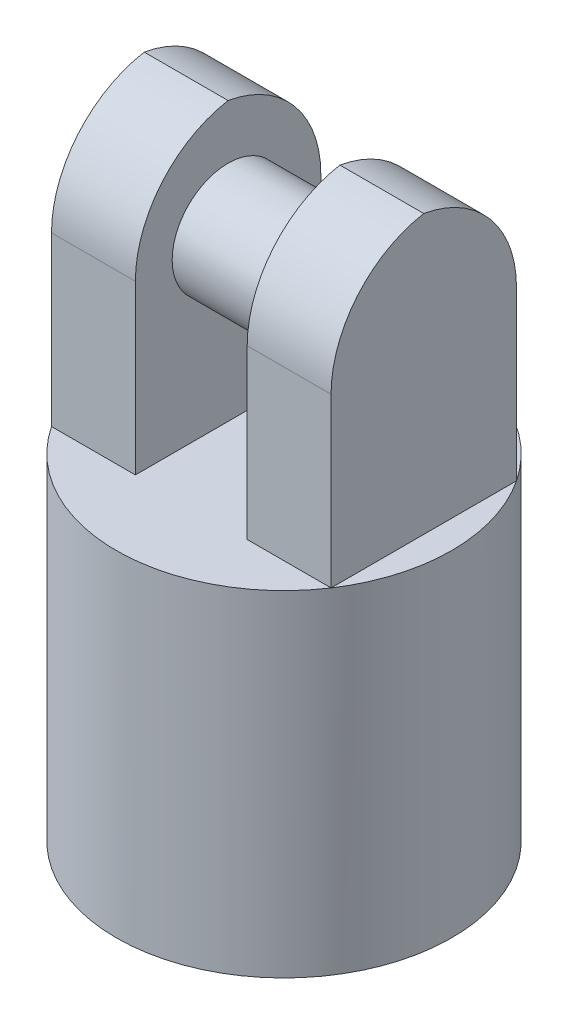
ISO-10303-21;
HEADER;
FILE_DESCRIPTION(('STEP AP214'),'2;1');
FILE_NAME('part.step','',(''),(''),'','','');
FILE_SCHEMA(('AUTOMOTIVE_DESIGN { 1 0 10303 214 1 1 1 1 }'));
ENDSEC;
DATA;
#1=APPLICATION_CONTEXT('core data for automotive mechanical design processes');
#2=APPLICATION_PROTOCOL_DEFINITION('international standard','automotive_design',2000,#1);
#3=PRODUCT_CONTEXT('',#1,'mechanical');
#4=PRODUCT('Part','Part','',(#3));
#5=PRODUCT_RELATED_PRODUCT_CATEGORY('part','',(#4));
#6=PRODUCT_DEFINITION_FORMATION('','',#4);
#7=PRODUCT_DEFINITION_CONTEXT('part definition',#1,'design');
#8=PRODUCT_DEFINITION('design','',#6,#7);
#9=PRODUCT_DEFINITION_SHAPE('','',#8);
#10=(LENGTH_UNIT() NAMED_UNIT(*) SI_UNIT(.MILLI.,.METRE.));
#11=(NAMED_UNIT(*) PLANE_ANGLE_UNIT() SI_UNIT($,.RADIAN.));
#12=(NAMED_UNIT(*) SI_UNIT($,.STERADIAN.) SOLID_ANGLE_UNIT());
#13=UNCERTAINTY_MEASURE_WITH_UNIT(LENGTH_MEASURE(1.E-05),#10,'distance_accuracy_value','');
#14=(GEOMETRIC_REPRESENTATION_CONTEXT(3) GLOBAL_UNCERTAINTY_ASSIGNED_CONTEXT((#13)) GLOBAL_UNIT_ASSIGNED_CONTEXT((#10,
#11,#12)) REPRESENTATION_CONTEXT('',''));
#15=CARTESIAN_POINT('',(0.,0.,0.));
#16=DIRECTION('',(0.,0.,1.));
#17=DIRECTION('',(1.,0.,0.));
#18=AXIS2_PLACEMENT_3D('',#15,#16,#17);
#19=CARTESIAN_POINT('',(-31.75,139.7,-21.0605674187568));
#20=DIRECTION('',(0.,0.,1.));
#21=DIRECTION('',(1.,0.,0.));
#22=AXIS2_PLACEMENT_3D('',#19,#20,#21);
#23=PLANE('',#22);
#24=DIRECTION('',(0.,1.,0.));
#25=VECTOR('',#24,1.);
#26=CARTESIAN_POINT('',(12.7,76.2,-21.0605674187568));
#27=LINE('',#26,#25);
#28=CARTESIAN_POINT('',(12.7,76.2,-21.0605674187568));
#29=VERTEX_POINT('',#28);
#30=CARTESIAN_POINT('',(12.7,114.3,-21.0605674187568));
#31=VERTEX_POINT('',#30);
#32=EDGE_CURVE('E120',#29,#31,#27,.T.);
#33=ORIENTED_EDGE('',*,*,#32,.T.);
#34=DIRECTION('',(-1.,0.,0.));
#35=VECTOR('',#34,1.);
#36=CARTESIAN_POINT('',(-31.75,114.3,-21.0605674187568));
#37=LINE('',#36,#35);
#38=CARTESIAN_POINT('',(31.75,114.3,-21.0605674187568));
#39=VERTEX_POINT('',#38);
#40=EDGE_CURVE('E211',#31,#39,#37,.F.);
#41=ORIENTED_EDGE('',*,*,#40,.T.);
#42=DIRECTION('',(0.,-1.,0.));
#43=VECTOR('',#42,1.);
#44=CARTESIAN_POINT('',(31.75,139.7,-21.0605674187568));
#45=LINE('',#44,#43);
#46=CARTESIAN_POINT('',(31.75,76.2,-21.0605674187568));
#47=VERTEX_POINT('',#46);
#48=EDGE_CURVE('E149',#39,#47,#45,.T.);
#49=ORIENTED_EDGE('',*,*,#48,.T.);
#50=DIRECTION('',(-1.,0.,0.));
#51=VECTOR('',#50,1.);
#52=CARTESIAN_POINT('',(-31.75,76.2,-21.0605674187568));
#53=LINE('',#52,#51);
#54=EDGE_CURVE('E141',#47,#29,#53,.T.);
#55=ORIENTED_EDGE('',*,*,#54,.T.);
#56=EDGE_LOOP('',(#33,#41,#49,#55));
#57=FACE_BOUND('',#56,.T.);
#58=ADVANCED_FACE('F45',(#57),#23,.F.);
#59=CARTESIAN_POINT('',(-31.75,139.7,21.0605674187568));
#60=DIRECTION('',(0.,0.,-1.));
#61=DIRECTION('',(-1.,0.,0.));
#62=AXIS2_PLACEMENT_3D('',#59,#60,#61);
#63=PLANE('',#62);
#64=DIRECTION('',(0.,-1.,0.));
#65=VECTOR('',#64,1.);
#66=CARTESIAN_POINT('',(31.75,139.7,21.0605674187568));
#67=LINE('',#66,#65);
#68=CARTESIAN_POINT('',(31.75,114.3,21.0605674187568));
#69=VERTEX_POINT('',#68);
#70=CARTESIAN_POINT('',(31.75,76.2,21.0605674187568));
#71=VERTEX_POINT('',#70);
#72=EDGE_CURVE('E166',#69,#71,#67,.T.);
#73=ORIENTED_EDGE('',*,*,#72,.F.);
#74=DIRECTION('',(1.,0.,0.));
#75=VECTOR('',#74,1.);
#76=CARTESIAN_POINT('',(-31.75,114.3,21.0605674187568));
#77=LINE('',#76,#75);
#78=CARTESIAN_POINT('',(12.7,114.3,21.0605674187568));
#79=VERTEX_POINT('',#78);
#80=EDGE_CURVE('E11',#69,#79,#77,.F.);
#81=ORIENTED_EDGE('',*,*,#80,.T.);
#82=DIRECTION('',(0.,1.,0.));
#83=VECTOR('',#82,1.);
#84=CARTESIAN_POINT('',(12.7,76.2,21.0605674187568));
#85=LINE('',#84,#83);
#86=CARTESIAN_POINT('',(12.7,76.2,21.0605674187568));
#87=VERTEX_POINT('',#86);
#88=EDGE_CURVE('E241',#87,#79,#85,.T.);
#89=ORIENTED_EDGE('',*,*,#88,.F.);
#90=DIRECTION('',(1.,0.,0.));
#91=VECTOR('',#90,1.);
#92=CARTESIAN_POINT('',(-31.75,76.2,21.0605674187568));
#93=LINE('',#92,#91);
#94=EDGE_CURVE('E145',#87,#71,#93,.T.);
#95=ORIENTED_EDGE('',*,*,#94,.T.);
#96=EDGE_LOOP('',(#73,#81,#89,#95));
#97=FACE_BOUND('',#96,.T.);
#98=ADVANCED_FACE('F295',(#97),#63,.F.);
#99=CARTESIAN_POINT('',(0.,76.2,0.));
#100=DIRECTION('',(0.,1.,0.));
#101=DIRECTION('',(0.,0.,1.));
#102=AXIS2_PLACEMENT_3D('',#99,#100,#101);
#103=PLANE('',#102);
#104=DIRECTION('',(0.,0.,-1.));
#105=VECTOR('',#104,1.);
#106=CARTESIAN_POINT('',(31.75,76.2,21.0605674187568));
#107=LINE('',#106,#105);
#108=EDGE_CURVE('E159',#71,#47,#107,.T.);
#109=ORIENTED_EDGE('',*,*,#108,.F.);
#110=CARTESIAN_POINT('',(0.,76.2,0.));
#111=DIRECTION('',(0.,1.,0.));
#112=DIRECTION('',(0.,0.,1.));
#113=AXIS2_PLACEMENT_3D('',#110,#111,#112);
#114=CIRCLE('',#113,38.1);
#115=EDGE_CURVE('E178',#71,#47,#114,.T.);
#116=ORIENTED_EDGE('',*,*,#115,.T.);
#117=EDGE_LOOP('',(#109,#116));
#118=FACE_BOUND('',#117,.T.);
#119=ADVANCED_FACE('F290',(#118),#103,.T.);
#120=DIRECTION('',(0.,0.,1.));
#121=VECTOR('',#120,1.);
#122=CARTESIAN_POINT('',(-31.75,76.2,21.0605674187568));
#123=LINE('',#122,#121);
#124=CARTESIAN_POINT('',(-31.75,76.2,-21.0605674187568));
#125=VERTEX_POINT('',#124);
#126=CARTESIAN_POINT('',(-31.75,76.2,21.0605674187568));
#127=VERTEX_POINT('',#126);
#128=EDGE_CURVE('E151',#125,#127,#123,.T.);
#129=ORIENTED_EDGE('',*,*,#128,.F.);
#130=EDGE_CURVE('E264',#125,#127,#114,.T.);
#131=ORIENTED_EDGE('',*,*,#130,.T.);
#132=EDGE_LOOP('',(#129,#131));
#133=FACE_BOUND('',#132,.T.);
#134=ADVANCED_FACE('F272',(#133),#103,.T.);
#135=CARTESIAN_POINT('',(0.,76.2,0.));
#136=DIRECTION('',(0.,-1.,0.));
#137=DIRECTION('',(0.,0.,-1.));
#138=AXIS2_PLACEMENT_3D('',#135,#136,#137);
#139=CYLINDRICAL_SURFACE('',#138,38.1);
#140=ORIENTED_EDGE('',*,*,#115,.F.);
#141=EDGE_CURVE('E184',#127,#71,#114,.T.);
#142=ORIENTED_EDGE('',*,*,#141,.F.);
#143=ORIENTED_EDGE('',*,*,#130,.F.);
#144=EDGE_CURVE('E183',#47,#125,#114,.T.);
#145=ORIENTED_EDGE('',*,*,#144,.F.);
#146=EDGE_LOOP('',(#140,#142,#143,#145));
#147=FACE_BOUND('',#146,.T.);
#148=CARTESIAN_POINT('',(0.,0.,0.));
#149=DIRECTION('',(0.,1.,0.));
#150=DIRECTION('',(0.,0.,1.));
#151=AXIS2_PLACEMENT_3D('',#148,#149,#150);
#152=CIRCLE('',#151,38.1);
#153=CARTESIAN_POINT('',(0.,0.,38.1));
#154=VERTEX_POINT('',#153);
#155=EDGE_CURVE('E177',#154,#154,#152,.T.);
#156=ORIENTED_EDGE('',*,*,#155,.T.);
#157=EDGE_LOOP('',(#156));
#158=FACE_BOUND('',#157,.T.);
#159=ADVANCED_FACE('F268',(#147,#158),#139,.T.);
#160=ORIENTED_EDGE('',*,*,#54,.F.);
#161=ORIENTED_EDGE('',*,*,#144,.T.);
#162=CARTESIAN_POINT('',(-12.7,76.2,-21.0605674187568));
#163=VERTEX_POINT('',#162);
#164=EDGE_CURVE('E152',#163,#125,#53,.T.);
#165=ORIENTED_EDGE('',*,*,#164,.F.);
#166=DIRECTION('',(0.,0.,1.));
#167=VECTOR('',#166,1.);
#168=CARTESIAN_POINT('',(-12.7,76.2,21.0605674187568));
#169=LINE('',#168,#167);
#170=CARTESIAN_POINT('',(-12.7,76.2,21.0605674187568));
#171=VERTEX_POINT('',#170);
#172=EDGE_CURVE('E134',#163,#171,#169,.T.);
#173=ORIENTED_EDGE('',*,*,#172,.T.);
#174=EDGE_CURVE('E162',#127,#171,#93,.T.);
#175=ORIENTED_EDGE('',*,*,#174,.F.);
#176=ORIENTED_EDGE('',*,*,#141,.T.);
#177=ORIENTED_EDGE('',*,*,#94,.F.);
#178=DIRECTION('',(0.,0.,-1.));
#179=VECTOR('',#178,1.);
#180=CARTESIAN_POINT('',(12.7,76.2,21.0605674187568));
#181=LINE('',#180,#179);
#182=EDGE_CURVE('E124',#87,#29,#181,.T.);
#183=ORIENTED_EDGE('',*,*,#182,.T.);
#184=EDGE_LOOP('',(#160,#161,#165,#173,#175,#176,#177,#183));
#185=FACE_BOUND('',#184,.T.);
#186=ADVANCED_FACE('F139',(#185),#103,.T.);
#187=CARTESIAN_POINT('',(0.,0.,0.));
#188=DIRECTION('',(0.,1.,0.));
#189=DIRECTION('',(0.,0.,1.));
#190=AXIS2_PLACEMENT_3D('',#187,#188,#189);
#191=PLANE('',#190);
#192=CARTESIAN_POINT('',(0.,0.,0.));
#193=DIRECTION('',(0.,-1.,0.));
#194=DIRECTION('',(0.,0.,-1.));
#195=AXIS2_PLACEMENT_3D('',#192,#193,#194);
#196=CIRCLE('',#195,25.4);
#197=CARTESIAN_POINT('',(0.,0.,-25.4));
#198=VERTEX_POINT('',#197);
#199=EDGE_CURVE('E228',#198,#198,#196,.T.);
#200=ORIENTED_EDGE('',*,*,#199,.F.);
#201=EDGE_LOOP('',(#200));
#202=FACE_BOUND('',#201,.T.);
#203=ORIENTED_EDGE('',*,*,#155,.F.);
#204=EDGE_LOOP('',(#203));
#205=FACE_BOUND('',#204,.T.);
#206=ADVANCED_FACE('F325',(#202,#205),#191,.F.);
#207=CARTESIAN_POINT('',(31.75,139.7,21.0605674187568));
#208=DIRECTION('',(-1.,0.,0.));
#209=DIRECTION('',(0.,0.,1.));
#210=AXIS2_PLACEMENT_3D('',#207,#208,#209);
#211=PLANE('',#210);
#212=ORIENTED_EDGE('',*,*,#48,.F.);
#213=CARTESIAN_POINT('',(31.75,114.3,4.3394325812432));
#214=DIRECTION('',(-1.,0.,0.));
#215=DIRECTION('',(0.,0.,1.));
#216=AXIS2_PLACEMENT_3D('',#213,#214,#215);
#217=CIRCLE('',#216,25.4);
#218=CARTESIAN_POINT('',(31.75,139.326572375634,0.));
#219=VERTEX_POINT('',#218);
#220=EDGE_CURVE('E55',#39,#219,#217,.F.);
#221=ORIENTED_EDGE('',*,*,#220,.T.);
#222=CARTESIAN_POINT('',(31.75,114.3,-4.3394325812432));
#223=DIRECTION('',(-1.,0.,0.));
#224=DIRECTION('',(0.,0.,1.));
#225=AXIS2_PLACEMENT_3D('',#222,#223,#224);
#226=CIRCLE('',#225,25.4);
#227=EDGE_CURVE('E66',#219,#69,#226,.F.);
#228=ORIENTED_EDGE('',*,*,#227,.T.);
#229=ORIENTED_EDGE('',*,*,#72,.T.);
#230=ORIENTED_EDGE('',*,*,#108,.T.);
#231=EDGE_LOOP('',(#212,#221,#228,#229,#230));
#232=FACE_BOUND('',#231,.T.);
#233=ADVANCED_FACE('F291',(#232),#211,.F.);
#234=DIRECTION('',(0.,-1.,0.));
#235=VECTOR('',#234,1.);
#236=CARTESIAN_POINT('',(-31.75,139.7,-21.0605674187568));
#237=LINE('',#236,#235);
#238=CARTESIAN_POINT('',(-31.75,114.3,-21.0605674187568));
#239=VERTEX_POINT('',#238);
#240=EDGE_CURVE('E172',#239,#125,#237,.T.);
#241=ORIENTED_EDGE('',*,*,#240,.F.);
#242=DIRECTION('',(-1.,0.,0.));
#243=VECTOR('',#242,1.);
#244=CARTESIAN_POINT('',(-31.75,114.3,-21.0605674187568));
#245=LINE('',#244,#243);
#246=CARTESIAN_POINT('',(-12.7,114.3,-21.0605674187568));
#247=VERTEX_POINT('',#246);
#248=EDGE_CURVE('E193',#239,#247,#245,.F.);
#249=ORIENTED_EDGE('',*,*,#248,.T.);
#250=DIRECTION('',(0.,1.,0.));
#251=VECTOR('',#250,1.);
#252=CARTESIAN_POINT('',(-12.7,76.2,-21.0605674187568));
#253=LINE('',#252,#251);
#254=EDGE_CURVE('E133',#163,#247,#253,.T.);
#255=ORIENTED_EDGE('',*,*,#254,.F.);
#256=ORIENTED_EDGE('',*,*,#164,.T.);
#257=EDGE_LOOP('',(#241,#249,#255,#256));
#258=FACE_BOUND('',#257,.T.);
#259=ADVANCED_FACE('F257',(#258),#23,.F.);
#260=CARTESIAN_POINT('',(-31.75,139.7,21.0605674187568));
#261=DIRECTION('',(1.,0.,0.));
#262=DIRECTION('',(0.,0.,-1.));
#263=AXIS2_PLACEMENT_3D('',#260,#261,#262);
#264=PLANE('',#263);
#265=CARTESIAN_POINT('',(-31.75,114.3,-4.3394325812432));
#266=DIRECTION('',(1.,0.,0.));
#267=DIRECTION('',(0.,0.,-1.));
#268=AXIS2_PLACEMENT_3D('',#265,#266,#267);
#269=CIRCLE('',#268,25.4);
#270=CARTESIAN_POINT('',(-31.75,114.3,21.0605674187568));
#271=VERTEX_POINT('',#270);
#272=CARTESIAN_POINT('',(-31.75,139.326572375634,0.));
#273=VERTEX_POINT('',#272);
#274=EDGE_CURVE('E182',#271,#273,#269,.F.);
#275=ORIENTED_EDGE('',*,*,#274,.T.);
#276=CARTESIAN_POINT('',(-31.75,114.3,4.3394325812432));
#277=DIRECTION('',(1.,0.,0.));
#278=DIRECTION('',(0.,0.,-1.));
#279=AXIS2_PLACEMENT_3D('',#276,#277,#278);
#280=CIRCLE('',#279,25.4);
#281=EDGE_CURVE('E190',#273,#239,#280,.F.);
#282=ORIENTED_EDGE('',*,*,#281,.T.);
#283=ORIENTED_EDGE('',*,*,#240,.T.);
#284=ORIENTED_EDGE('',*,*,#128,.T.);
#285=DIRECTION('',(0.,-1.,0.));
#286=VECTOR('',#285,1.);
#287=CARTESIAN_POINT('',(-31.75,139.7,21.0605674187568));
#288=LINE('',#287,#286);
#289=EDGE_CURVE('E169',#271,#127,#288,.T.);
#290=ORIENTED_EDGE('',*,*,#289,.F.);
#291=EDGE_LOOP('',(#275,#282,#283,#284,#290));
#292=FACE_BOUND('',#291,.T.);
#293=ADVANCED_FACE('F275',(#292),#264,.F.);
#294=DIRECTION('',(0.,1.,0.));
#295=VECTOR('',#294,1.);
#296=CARTESIAN_POINT('',(-12.7,76.2,21.0605674187568));
#297=LINE('',#296,#295);
#298=CARTESIAN_POINT('',(-12.7,114.3,21.0605674187568));
#299=VERTEX_POINT('',#298);
#300=EDGE_CURVE('E244',#171,#299,#297,.T.);
#301=ORIENTED_EDGE('',*,*,#300,.T.);
#302=DIRECTION('',(1.,0.,0.));
#303=VECTOR('',#302,1.);
#304=CARTESIAN_POINT('',(-31.75,114.3,21.0605674187568));
#305=LINE('',#304,#303);
#306=EDGE_CURVE('E203',#299,#271,#305,.F.);
#307=ORIENTED_EDGE('',*,*,#306,.T.);
#308=ORIENTED_EDGE('',*,*,#289,.T.);
#309=ORIENTED_EDGE('',*,*,#174,.T.);
#310=EDGE_LOOP('',(#301,#307,#308,#309));
#311=FACE_BOUND('',#310,.T.);
#312=ADVANCED_FACE('F285',(#311),#63,.F.);
#313=CARTESIAN_POINT('',(12.7,76.2,21.0605674187568));
#314=DIRECTION('',(1.,0.,0.));
#315=DIRECTION('',(0.,0.,-1.));
#316=AXIS2_PLACEMENT_3D('',#313,#314,#315);
#317=PLANE('',#316);
#318=CARTESIAN_POINT('',(12.7,114.3,0.));
#319=DIRECTION('',(1.,0.,0.));
#320=DIRECTION('',(0.,0.,-1.));
#321=AXIS2_PLACEMENT_3D('',#318,#319,#320);
#322=CIRCLE('',#321,12.7);
#323=CARTESIAN_POINT('',(12.7,114.3,-12.7));
#324=VERTEX_POINT('',#323);
#325=EDGE_CURVE('E234',#324,#324,#322,.T.);
#326=ORIENTED_EDGE('',*,*,#325,.T.);
#327=EDGE_LOOP('',(#326));
#328=FACE_BOUND('',#327,.T.);
#329=CARTESIAN_POINT('',(12.7,114.3,-4.3394325812432));
#330=DIRECTION('',(1.,0.,0.));
#331=DIRECTION('',(0.,0.,-1.));
#332=AXIS2_PLACEMENT_3D('',#329,#330,#331);
#333=CIRCLE('',#332,25.4);
#334=CARTESIAN_POINT('',(12.7,139.326572375634,0.));
#335=VERTEX_POINT('',#334);
#336=EDGE_CURVE('E206',#79,#335,#333,.F.);
#337=ORIENTED_EDGE('',*,*,#336,.T.);
#338=CARTESIAN_POINT('',(12.7,114.3,4.3394325812432));
#339=DIRECTION('',(1.,0.,0.));
#340=DIRECTION('',(0.,0.,-1.));
#341=AXIS2_PLACEMENT_3D('',#338,#339,#340);
#342=CIRCLE('',#341,25.4);
#343=EDGE_CURVE('E127',#335,#31,#342,.F.);
#344=ORIENTED_EDGE('',*,*,#343,.T.);
#345=ORIENTED_EDGE('',*,*,#32,.F.);
#346=ORIENTED_EDGE('',*,*,#182,.F.);
#347=ORIENTED_EDGE('',*,*,#88,.T.);
#348=EDGE_LOOP('',(#337,#344,#345,#346,#347));
#349=FACE_BOUND('',#348,.T.);
#350=ADVANCED_FACE('F122',(#328,#349),#317,.F.);
#351=CARTESIAN_POINT('',(-12.7,76.2,21.0605674187568));
#352=DIRECTION('',(-1.,0.,0.));
#353=DIRECTION('',(0.,0.,1.));
#354=AXIS2_PLACEMENT_3D('',#351,#352,#353);
#355=PLANE('',#354);
#356=CARTESIAN_POINT('',(-12.7,114.3,0.));
#357=DIRECTION('',(-1.,0.,0.));
#358=DIRECTION('',(0.,0.,1.));
#359=AXIS2_PLACEMENT_3D('',#356,#357,#358);
#360=CIRCLE('',#359,12.7);
#361=CARTESIAN_POINT('',(-12.7,114.3,12.7));
#362=VERTEX_POINT('',#361);
#363=EDGE_CURVE('E49',#362,#362,#360,.T.);
#364=ORIENTED_EDGE('',*,*,#363,.T.);
#365=EDGE_LOOP('',(#364));
#366=FACE_BOUND('',#365,.T.);
#367=ORIENTED_EDGE('',*,*,#254,.T.);
#368=CARTESIAN_POINT('',(-12.7,114.3,4.3394325812432));
#369=DIRECTION('',(-1.,0.,0.));
#370=DIRECTION('',(0.,0.,1.));
#371=AXIS2_PLACEMENT_3D('',#368,#369,#370);
#372=CIRCLE('',#371,25.4);
#373=CARTESIAN_POINT('',(-12.7,139.326572375634,0.));
#374=VERTEX_POINT('',#373);
#375=EDGE_CURVE('E200',#247,#374,#372,.F.);
#376=ORIENTED_EDGE('',*,*,#375,.T.);
#377=CARTESIAN_POINT('',(-12.7,114.3,-4.3394325812432));
#378=DIRECTION('',(-1.,0.,0.));
#379=DIRECTION('',(0.,0.,1.));
#380=AXIS2_PLACEMENT_3D('',#377,#378,#379);
#381=CIRCLE('',#380,25.4);
#382=EDGE_CURVE('E197',#374,#299,#381,.F.);
#383=ORIENTED_EDGE('',*,*,#382,.T.);
#384=ORIENTED_EDGE('',*,*,#300,.F.);
#385=ORIENTED_EDGE('',*,*,#172,.F.);
#386=EDGE_LOOP('',(#367,#376,#383,#384,#385));
#387=FACE_BOUND('',#386,.T.);
#388=ADVANCED_FACE('F252',(#366,#387),#355,.F.);
#389=CARTESIAN_POINT('',(0.,114.3,-4.3394325812432));
#390=DIRECTION('',(1.,0.,0.));
#391=DIRECTION('',(0.,0.,-1.));
#392=AXIS2_PLACEMENT_3D('',#389,#390,#391);
#393=CYLINDRICAL_SURFACE('',#392,25.4);
#394=ORIENTED_EDGE('',*,*,#306,.F.);
#395=ORIENTED_EDGE('',*,*,#382,.F.);
#396=DIRECTION('',(1.,0.,0.));
#397=VECTOR('',#396,1.);
#398=CARTESIAN_POINT('',(-22.225,139.326572375634,0.));
#399=LINE('',#398,#397);
#400=EDGE_CURVE('E147',#273,#374,#399,.T.);
#401=ORIENTED_EDGE('',*,*,#400,.F.);
#402=ORIENTED_EDGE('',*,*,#274,.F.);
#403=EDGE_LOOP('',(#394,#395,#401,#402));
#404=FACE_BOUND('',#403,.T.);
#405=ADVANCED_FACE('F283',(#404),#393,.T.);
#406=CARTESIAN_POINT('',(0.,114.3,4.3394325812432));
#407=DIRECTION('',(-1.,0.,0.));
#408=DIRECTION('',(0.,0.,1.));
#409=AXIS2_PLACEMENT_3D('',#406,#407,#408);
#410=CYLINDRICAL_SURFACE('',#409,25.4);
#411=ORIENTED_EDGE('',*,*,#375,.F.);
#412=ORIENTED_EDGE('',*,*,#248,.F.);
#413=ORIENTED_EDGE('',*,*,#281,.F.);
#414=ORIENTED_EDGE('',*,*,#400,.T.);
#415=EDGE_LOOP('',(#411,#412,#413,#414));
#416=FACE_BOUND('',#415,.T.);
#417=ADVANCED_FACE('F279',(#416),#410,.T.);
#418=CARTESIAN_POINT('',(0.,114.3,-4.3394325812432));
#419=DIRECTION('',(1.,0.,0.));
#420=DIRECTION('',(0.,0.,-1.));
#421=AXIS2_PLACEMENT_3D('',#418,#419,#420);
#422=CYLINDRICAL_SURFACE('',#421,25.4);
#423=ORIENTED_EDGE('',*,*,#80,.F.);
#424=ORIENTED_EDGE('',*,*,#227,.F.);
#425=DIRECTION('',(1.,0.,0.));
#426=VECTOR('',#425,1.);
#427=CARTESIAN_POINT('',(22.225,139.326572375634,0.));
#428=LINE('',#427,#426);
#429=EDGE_CURVE('E220',#335,#219,#428,.T.);
#430=ORIENTED_EDGE('',*,*,#429,.F.);
#431=ORIENTED_EDGE('',*,*,#336,.F.);
#432=EDGE_LOOP('',(#423,#424,#430,#431));
#433=FACE_BOUND('',#432,.T.);
#434=ADVANCED_FACE('F47',(#433),#422,.T.);
#435=CARTESIAN_POINT('',(0.,114.3,4.3394325812432));
#436=DIRECTION('',(-1.,0.,0.));
#437=DIRECTION('',(0.,0.,1.));
#438=AXIS2_PLACEMENT_3D('',#435,#436,#437);
#439=CYLINDRICAL_SURFACE('',#438,25.4);
#440=ORIENTED_EDGE('',*,*,#220,.F.);
#441=ORIENTED_EDGE('',*,*,#40,.F.);
#442=ORIENTED_EDGE('',*,*,#343,.F.);
#443=ORIENTED_EDGE('',*,*,#429,.T.);
#444=EDGE_LOOP('',(#440,#441,#442,#443));
#445=FACE_BOUND('',#444,.T.);
#446=ADVANCED_FACE('F299',(#445),#439,.T.);
#447=CARTESIAN_POINT('',(0.,50.8,0.));
#448=DIRECTION('',(0.,-1.,0.));
#449=DIRECTION('',(0.,0.,-1.));
#450=AXIS2_PLACEMENT_3D('',#447,#448,#449);
#451=CYLINDRICAL_SURFACE('',#450,25.4);
#452=CARTESIAN_POINT('',(0.,50.8,0.));
#453=DIRECTION('',(0.,-1.,0.));
#454=DIRECTION('',(0.,0.,-1.));
#455=AXIS2_PLACEMENT_3D('',#452,#453,#454);
#456=CIRCLE('',#455,25.4);
#457=CARTESIAN_POINT('',(0.,50.8,-25.4));
#458=VERTEX_POINT('',#457);
#459=EDGE_CURVE('E223',#458,#458,#456,.T.);
#460=ORIENTED_EDGE('',*,*,#459,.F.);
#461=EDGE_LOOP('',(#460));
#462=FACE_BOUND('',#461,.T.);
#463=ORIENTED_EDGE('',*,*,#199,.T.);
#464=EDGE_LOOP('',(#463));
#465=FACE_BOUND('',#464,.T.);
#466=ADVANCED_FACE('F301',(#462,#465),#451,.F.);
#467=CARTESIAN_POINT('',(0.,50.8,0.));
#468=DIRECTION('',(0.,-1.,0.));
#469=DIRECTION('',(0.,0.,-1.));
#470=AXIS2_PLACEMENT_3D('',#467,#468,#469);
#471=PLANE('',#470);
#472=ORIENTED_EDGE('',*,*,#459,.T.);
#473=EDGE_LOOP('',(#472));
#474=FACE_BOUND('',#473,.T.);
#475=ADVANCED_FACE('F307',(#474),#471,.T.);
#476=CARTESIAN_POINT('',(-21.59,114.3,0.));
#477=DIRECTION('',(1.,0.,0.));
#478=DIRECTION('',(0.,0.,-1.));
#479=AXIS2_PLACEMENT_3D('',#476,#477,#478);
#480=CYLINDRICAL_SURFACE('',#479,12.7);
#481=ORIENTED_EDGE('',*,*,#363,.F.);
#482=EDGE_LOOP('',(#481));
#483=FACE_BOUND('',#482,.T.);
#484=ORIENTED_EDGE('',*,*,#325,.F.);
#485=EDGE_LOOP('',(#484));
#486=FACE_BOUND('',#485,.T.);
#487=ADVANCED_FACE('F450',(#483,#486),#480,.T.);
#488=CLOSED_SHELL('',(#58,#98,#119,#134,#159,#186,#206,#233,#259,#293,#312,#350,#388,#405,#417,
#434,#446,#466,#475,#487));
#489=MANIFOLD_SOLID_BREP('B2',#488);
#490=ADVANCED_BREP_SHAPE_REPRESENTATION('',(#18,#489),#14);
#491=SHAPE_DEFINITION_REPRESENTATION(#9,#490);
ENDSEC;
END-ISO-10303-21;
